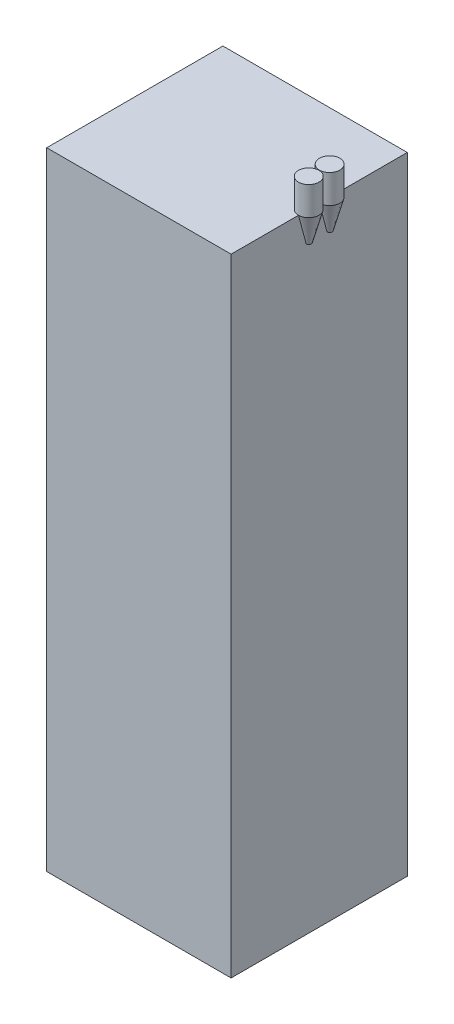
ISO-10303-21;
HEADER;
FILE_DESCRIPTION(('STEP AP214'),'2;1');
FILE_NAME('part.step','',(''),(''),'','','');
FILE_SCHEMA(('AUTOMOTIVE_DESIGN { 1 0 10303 214 1 1 1 1 }'));
ENDSEC;
DATA;
#1=APPLICATION_CONTEXT('core data for automotive mechanical design processes');
#2=APPLICATION_PROTOCOL_DEFINITION('international standard','automotive_design',2000,#1);
#3=PRODUCT_CONTEXT('',#1,'mechanical');
#4=PRODUCT('Part','Part','',(#3));
#5=PRODUCT_RELATED_PRODUCT_CATEGORY('part','',(#4));
#6=PRODUCT_DEFINITION_FORMATION('','',#4);
#7=PRODUCT_DEFINITION_CONTEXT('part definition',#1,'design');
#8=PRODUCT_DEFINITION('design','',#6,#7);
#9=PRODUCT_DEFINITION_SHAPE('','',#8);
#10=(LENGTH_UNIT() NAMED_UNIT(*) SI_UNIT(.MILLI.,.METRE.));
#11=(NAMED_UNIT(*) PLANE_ANGLE_UNIT() SI_UNIT($,.RADIAN.));
#12=(NAMED_UNIT(*) SI_UNIT($,.STERADIAN.) SOLID_ANGLE_UNIT());
#13=UNCERTAINTY_MEASURE_WITH_UNIT(LENGTH_MEASURE(1.E-05),#10,'distance_accuracy_value','');
#14=(GEOMETRIC_REPRESENTATION_CONTEXT(3) GLOBAL_UNCERTAINTY_ASSIGNED_CONTEXT((#13)) GLOBAL_UNIT_ASSIGNED_CONTEXT((#10,
#11,#12)) REPRESENTATION_CONTEXT('',''));
#15=CARTESIAN_POINT('',(0.,0.,0.));
#16=DIRECTION('',(0.,0.,1.));
#17=DIRECTION('',(1.,0.,0.));
#18=AXIS2_PLACEMENT_3D('',#15,#16,#17);
#19=CARTESIAN_POINT('',(22.5,153.,21.5));
#20=DIRECTION('',(-1.,0.,0.));
#21=DIRECTION('',(0.,0.,1.));
#22=AXIS2_PLACEMENT_3D('',#19,#20,#21);
#23=PLANE('',#22);
#24=DIRECTION('',(0.,0.965925826289068,0.258819045102521));
#25=VECTOR('',#24,1.);
#26=CARTESIAN_POINT('',(22.5,143.669872981078,-2.55));
#27=LINE('',#26,#25);
#28=CARTESIAN_POINT('',(22.5,153.,-0.050000000000001));
#29=VERTEX_POINT('',#28);
#30=CARTESIAN_POINT('',(22.5,146.,-1.92564434701787));
#31=VERTEX_POINT('',#30);
#32=EDGE_CURVE('E108',#29,#31,#27,.F.);
#33=ORIENTED_EDGE('',*,*,#32,.F.);
#34=DIRECTION('',(0.,0.,-1.));
#35=VECTOR('',#34,1.);
#36=CARTESIAN_POINT('',(22.5,153.,21.5));
#37=LINE('',#36,#35);
#38=CARTESIAN_POINT('',(22.5,153.,0.050000000000001));
#39=VERTEX_POINT('',#38);
#40=EDGE_CURVE('E118',#39,#29,#37,.T.);
#41=ORIENTED_EDGE('',*,*,#40,.F.);
#42=DIRECTION('',(0.,-0.965925826289068,0.258819045102521));
#43=VECTOR('',#42,1.);
#44=CARTESIAN_POINT('',(22.5,143.669872981078,2.55));
#45=LINE('',#44,#43);
#46=CARTESIAN_POINT('',(22.5,146.,1.92564434701787));
#47=VERTEX_POINT('',#46);
#48=EDGE_CURVE('E63',#47,#39,#45,.F.);
#49=ORIENTED_EDGE('',*,*,#48,.F.);
#50=DIRECTION('',(0.,0.,1.));
#51=VECTOR('',#50,1.);
#52=CARTESIAN_POINT('',(22.5,146.,21.5));
#53=LINE('',#52,#51);
#54=CARTESIAN_POINT('',(22.5,146.,3.17435565298213));
#55=VERTEX_POINT('',#54);
#56=EDGE_CURVE('E48',#47,#55,#53,.T.);
#57=ORIENTED_EDGE('',*,*,#56,.T.);
#58=DIRECTION('',(0.,0.965925826289068,0.258819045102521));
#59=VECTOR('',#58,1.);
#60=CARTESIAN_POINT('',(22.5,143.669872981078,2.55));
#61=LINE('',#60,#59);
#62=CARTESIAN_POINT('',(22.5,153.,5.05));
#63=VERTEX_POINT('',#62);
#64=EDGE_CURVE('E168',#63,#55,#61,.F.);
#65=ORIENTED_EDGE('',*,*,#64,.F.);
#66=CARTESIAN_POINT('',(22.5,153.,21.5));
#67=VERTEX_POINT('',#66);
#68=EDGE_CURVE('E129',#67,#63,#37,.T.);
#69=ORIENTED_EDGE('',*,*,#68,.F.);
#70=DIRECTION('',(0.,-1.,0.));
#71=VECTOR('',#70,1.);
#72=CARTESIAN_POINT('',(22.5,153.,21.5));
#73=LINE('',#72,#71);
#74=CARTESIAN_POINT('',(22.5,0.,21.5));
#75=VERTEX_POINT('',#74);
#76=EDGE_CURVE('E146',#67,#75,#73,.T.);
#77=ORIENTED_EDGE('',*,*,#76,.T.);
#78=DIRECTION('',(0.,0.,-1.));
#79=VECTOR('',#78,1.);
#80=CARTESIAN_POINT('',(22.5,0.,21.5));
#81=LINE('',#80,#79);
#82=CARTESIAN_POINT('',(22.5,0.,-21.5));
#83=VERTEX_POINT('',#82);
#84=EDGE_CURVE('E156',#75,#83,#81,.T.);
#85=ORIENTED_EDGE('',*,*,#84,.T.);
#86=DIRECTION('',(0.,-1.,0.));
#87=VECTOR('',#86,1.);
#88=CARTESIAN_POINT('',(22.5,153.,-21.5));
#89=LINE('',#88,#87);
#90=CARTESIAN_POINT('',(22.5,153.,-21.5));
#91=VERTEX_POINT('',#90);
#92=EDGE_CURVE('E135',#91,#83,#89,.T.);
#93=ORIENTED_EDGE('',*,*,#92,.F.);
#94=CARTESIAN_POINT('',(22.5,153.,-5.05));
#95=VERTEX_POINT('',#94);
#96=EDGE_CURVE('E130',#95,#91,#37,.T.);
#97=ORIENTED_EDGE('',*,*,#96,.F.);
#98=DIRECTION('',(0.,-0.965925826289068,0.258819045102521));
#99=VECTOR('',#98,1.);
#100=CARTESIAN_POINT('',(22.5,143.669872981078,-2.55));
#101=LINE('',#100,#99);
#102=CARTESIAN_POINT('',(22.5,146.,-3.17435565298213));
#103=VERTEX_POINT('',#102);
#104=EDGE_CURVE('E55',#103,#95,#101,.F.);
#105=ORIENTED_EDGE('',*,*,#104,.F.);
#106=DIRECTION('',(0.,0.,1.));
#107=VECTOR('',#106,1.);
#108=CARTESIAN_POINT('',(22.5,146.,21.5));
#109=LINE('',#108,#107);
#110=EDGE_CURVE('E11',#103,#31,#109,.T.);
#111=ORIENTED_EDGE('',*,*,#110,.T.);
#112=EDGE_LOOP('',(#33,#41,#49,#57,#65,#69,#77,#85,#93,#97,#105,#111));
#113=FACE_BOUND('',#112,.T.);
#114=ADVANCED_FACE('F41',(#113),#23,.F.);
#115=CARTESIAN_POINT('',(-22.5,153.,-21.5));
#116=DIRECTION('',(0.,0.,1.));
#117=DIRECTION('',(1.,0.,0.));
#118=AXIS2_PLACEMENT_3D('',#115,#116,#117);
#119=PLANE('',#118);
#120=DIRECTION('',(-1.,0.,0.));
#121=VECTOR('',#120,1.);
#122=CARTESIAN_POINT('',(-22.5,0.,-21.5));
#123=LINE('',#122,#121);
#124=CARTESIAN_POINT('',(-22.5,0.,-21.5));
#125=VERTEX_POINT('',#124);
#126=EDGE_CURVE('E154',#83,#125,#123,.T.);
#127=ORIENTED_EDGE('',*,*,#126,.T.);
#128=DIRECTION('',(0.,-1.,0.));
#129=VECTOR('',#128,1.);
#130=CARTESIAN_POINT('',(-22.5,153.,-21.5));
#131=LINE('',#130,#129);
#132=CARTESIAN_POINT('',(-22.5,153.,-21.5));
#133=VERTEX_POINT('',#132);
#134=EDGE_CURVE('E140',#133,#125,#131,.T.);
#135=ORIENTED_EDGE('',*,*,#134,.F.);
#136=DIRECTION('',(-1.,0.,0.));
#137=VECTOR('',#136,1.);
#138=CARTESIAN_POINT('',(-22.5,153.,-21.5));
#139=LINE('',#138,#137);
#140=EDGE_CURVE('E163',#91,#133,#139,.T.);
#141=ORIENTED_EDGE('',*,*,#140,.F.);
#142=ORIENTED_EDGE('',*,*,#92,.T.);
#143=EDGE_LOOP('',(#127,#135,#141,#142));
#144=FACE_BOUND('',#143,.T.);
#145=ADVANCED_FACE('F182',(#144),#119,.F.);
#146=CARTESIAN_POINT('',(-22.5,153.,21.5));
#147=DIRECTION('',(1.,0.,0.));
#148=DIRECTION('',(0.,0.,-1.));
#149=AXIS2_PLACEMENT_3D('',#146,#147,#148);
#150=PLANE('',#149);
#151=DIRECTION('',(0.,0.,1.));
#152=VECTOR('',#151,1.);
#153=CARTESIAN_POINT('',(-22.5,0.,21.5));
#154=LINE('',#153,#152);
#155=CARTESIAN_POINT('',(-22.5,0.,21.5));
#156=VERTEX_POINT('',#155);
#157=EDGE_CURVE('E152',#125,#156,#154,.T.);
#158=ORIENTED_EDGE('',*,*,#157,.T.);
#159=DIRECTION('',(0.,-1.,0.));
#160=VECTOR('',#159,1.);
#161=CARTESIAN_POINT('',(-22.5,153.,21.5));
#162=LINE('',#161,#160);
#163=CARTESIAN_POINT('',(-22.5,153.,21.5));
#164=VERTEX_POINT('',#163);
#165=EDGE_CURVE('E143',#164,#156,#162,.T.);
#166=ORIENTED_EDGE('',*,*,#165,.F.);
#167=DIRECTION('',(0.,0.,1.));
#168=VECTOR('',#167,1.);
#169=CARTESIAN_POINT('',(-22.5,153.,21.5));
#170=LINE('',#169,#168);
#171=EDGE_CURVE('E161',#133,#164,#170,.T.);
#172=ORIENTED_EDGE('',*,*,#171,.F.);
#173=ORIENTED_EDGE('',*,*,#134,.T.);
#174=EDGE_LOOP('',(#158,#166,#172,#173));
#175=FACE_BOUND('',#174,.T.);
#176=ADVANCED_FACE('F187',(#175),#150,.F.);
#177=CARTESIAN_POINT('',(-22.5,153.,21.5));
#178=DIRECTION('',(0.,0.,-1.));
#179=DIRECTION('',(-1.,0.,0.));
#180=AXIS2_PLACEMENT_3D('',#177,#178,#179);
#181=PLANE('',#180);
#182=DIRECTION('',(1.,0.,0.));
#183=VECTOR('',#182,1.);
#184=CARTESIAN_POINT('',(-22.5,0.,21.5));
#185=LINE('',#184,#183);
#186=EDGE_CURVE('E150',#156,#75,#185,.T.);
#187=ORIENTED_EDGE('',*,*,#186,.T.);
#188=ORIENTED_EDGE('',*,*,#76,.F.);
#189=DIRECTION('',(1.,0.,0.));
#190=VECTOR('',#189,1.);
#191=CARTESIAN_POINT('',(-22.5,153.,21.5));
#192=LINE('',#191,#190);
#193=EDGE_CURVE('E149',#164,#67,#192,.T.);
#194=ORIENTED_EDGE('',*,*,#193,.F.);
#195=ORIENTED_EDGE('',*,*,#165,.T.);
#196=EDGE_LOOP('',(#187,#188,#194,#195));
#197=FACE_BOUND('',#196,.T.);
#198=ADVANCED_FACE('F192',(#197),#181,.F.);
#199=CARTESIAN_POINT('',(0.,153.,0.));
#200=DIRECTION('',(0.,-1.,0.));
#201=DIRECTION('',(0.,0.,-1.));
#202=AXIS2_PLACEMENT_3D('',#199,#200,#201);
#203=PLANE('',#202);
#204=CARTESIAN_POINT('',(22.5,153.,-2.55));
#205=DIRECTION('',(0.,-1.,0.));
#206=DIRECTION('',(0.,0.,-1.));
#207=AXIS2_PLACEMENT_3D('',#204,#205,#206);
#208=CIRCLE('',#207,2.5);
#209=EDGE_CURVE('E124',#95,#29,#208,.F.);
#210=ORIENTED_EDGE('',*,*,#209,.F.);
#211=ORIENTED_EDGE('',*,*,#96,.T.);
#212=ORIENTED_EDGE('',*,*,#140,.T.);
#213=ORIENTED_EDGE('',*,*,#171,.T.);
#214=ORIENTED_EDGE('',*,*,#193,.T.);
#215=ORIENTED_EDGE('',*,*,#68,.T.);
#216=CARTESIAN_POINT('',(22.5,153.,2.55));
#217=DIRECTION('',(0.,1.,0.));
#218=DIRECTION('',(0.,0.,1.));
#219=AXIS2_PLACEMENT_3D('',#216,#217,#218);
#220=CIRCLE('',#219,2.5);
#221=EDGE_CURVE('E128',#39,#63,#220,.T.);
#222=ORIENTED_EDGE('',*,*,#221,.F.);
#223=ORIENTED_EDGE('',*,*,#40,.T.);
#224=EDGE_LOOP('',(#210,#211,#212,#213,#214,#215,#222,#223));
#225=FACE_BOUND('',#224,.T.);
#226=ADVANCED_FACE('F123',(#225),#203,.F.);
#227=CARTESIAN_POINT('',(0.,0.,0.));
#228=DIRECTION('',(0.,-1.,0.));
#229=DIRECTION('',(0.,0.,-1.));
#230=AXIS2_PLACEMENT_3D('',#227,#228,#229);
#231=PLANE('',#230);
#232=ORIENTED_EDGE('',*,*,#84,.F.);
#233=ORIENTED_EDGE('',*,*,#186,.F.);
#234=ORIENTED_EDGE('',*,*,#157,.F.);
#235=ORIENTED_EDGE('',*,*,#126,.F.);
#236=EDGE_LOOP('',(#232,#233,#234,#235));
#237=FACE_BOUND('',#236,.T.);
#238=ADVANCED_FACE('F223',(#237),#231,.T.);
#239=CARTESIAN_POINT('',(22.5,160.,2.55));
#240=DIRECTION('',(0.,-1.,0.));
#241=DIRECTION('',(0.,0.,-1.));
#242=AXIS2_PLACEMENT_3D('',#239,#240,#241);
#243=CYLINDRICAL_SURFACE('',#242,2.5);
#244=CARTESIAN_POINT('',(22.5,160.,2.55));
#245=DIRECTION('',(0.,1.,0.));
#246=DIRECTION('',(0.,0.,1.));
#247=AXIS2_PLACEMENT_3D('',#244,#245,#246);
#248=CIRCLE('',#247,2.5);
#249=CARTESIAN_POINT('',(22.5,160.,5.05));
#250=VERTEX_POINT('',#249);
#251=EDGE_CURVE('E159',#250,#250,#248,.T.);
#252=ORIENTED_EDGE('',*,*,#251,.F.);
#253=EDGE_LOOP('',(#252));
#254=FACE_BOUND('',#253,.T.);
#255=EDGE_CURVE('E112',#63,#39,#220,.T.);
#256=ORIENTED_EDGE('',*,*,#255,.T.);
#257=ORIENTED_EDGE('',*,*,#221,.T.);
#258=EDGE_LOOP('',(#256,#257));
#259=FACE_BOUND('',#258,.T.);
#260=ADVANCED_FACE('F226',(#254,#259),#243,.T.);
#261=CARTESIAN_POINT('',(22.5,160.,2.55));
#262=DIRECTION('',(0.,1.,0.));
#263=DIRECTION('',(0.,0.,1.));
#264=AXIS2_PLACEMENT_3D('',#261,#262,#263);
#265=PLANE('',#264);
#266=ORIENTED_EDGE('',*,*,#251,.T.);
#267=EDGE_LOOP('',(#266));
#268=FACE_BOUND('',#267,.T.);
#269=ADVANCED_FACE('F231',(#268),#265,.T.);
#270=CARTESIAN_POINT('',(22.5,160.,-2.55));
#271=DIRECTION('',(0.,-1.,0.));
#272=DIRECTION('',(0.,0.,-1.));
#273=AXIS2_PLACEMENT_3D('',#270,#271,#272);
#274=CYLINDRICAL_SURFACE('',#273,2.5);
#275=CARTESIAN_POINT('',(22.5,160.,-2.55));
#276=DIRECTION('',(0.,1.,0.));
#277=DIRECTION('',(0.,0.,1.));
#278=AXIS2_PLACEMENT_3D('',#275,#276,#277);
#279=CIRCLE('',#278,2.5);
#280=CARTESIAN_POINT('',(22.5,160.,-0.050000000000001));
#281=VERTEX_POINT('',#280);
#282=EDGE_CURVE('E113',#281,#281,#279,.T.);
#283=ORIENTED_EDGE('',*,*,#282,.F.);
#284=EDGE_LOOP('',(#283));
#285=FACE_BOUND('',#284,.T.);
#286=CARTESIAN_POINT('',(22.5,153.,-2.55));
#287=DIRECTION('',(0.,1.,0.));
#288=DIRECTION('',(0.,0.,1.));
#289=AXIS2_PLACEMENT_3D('',#286,#287,#288);
#290=CIRCLE('',#289,2.5);
#291=EDGE_CURVE('E105',#29,#95,#290,.T.);
#292=ORIENTED_EDGE('',*,*,#291,.T.);
#293=ORIENTED_EDGE('',*,*,#209,.T.);
#294=EDGE_LOOP('',(#292,#293));
#295=FACE_BOUND('',#294,.T.);
#296=ADVANCED_FACE('F132',(#285,#295),#274,.T.);
#297=CARTESIAN_POINT('',(22.5,160.,-2.55));
#298=DIRECTION('',(0.,1.,0.));
#299=DIRECTION('',(0.,0.,1.));
#300=AXIS2_PLACEMENT_3D('',#297,#298,#299);
#301=PLANE('',#300);
#302=ORIENTED_EDGE('',*,*,#282,.T.);
#303=EDGE_LOOP('',(#302));
#304=FACE_BOUND('',#303,.T.);
#305=ADVANCED_FACE('F200',(#304),#301,.T.);
#306=CARTESIAN_POINT('',(22.5,146.,2.55));
#307=DIRECTION('',(0.,-1.,0.));
#308=DIRECTION('',(0.,0.,-1.));
#309=AXIS2_PLACEMENT_3D('',#306,#307,#308);
#310=PLANE('',#309);
#311=ORIENTED_EDGE('',*,*,#56,.F.);
#312=CARTESIAN_POINT('',(22.5,146.,2.55));
#313=DIRECTION('',(0.,-1.,0.));
#314=DIRECTION('',(0.,0.,-1.));
#315=AXIS2_PLACEMENT_3D('',#312,#313,#314);
#316=CIRCLE('',#315,0.624355652982134);
#317=EDGE_CURVE('E120',#47,#55,#316,.T.);
#318=ORIENTED_EDGE('',*,*,#317,.T.);
#319=EDGE_LOOP('',(#311,#318));
#320=FACE_BOUND('',#319,.T.);
#321=ADVANCED_FACE('F198',(#320),#310,.T.);
#322=CARTESIAN_POINT('',(22.5,153.,2.55));
#323=DIRECTION('',(0.,1.,0.));
#324=DIRECTION('',(0.,0.,-1.));
#325=AXIS2_PLACEMENT_3D('',#322,#323,#324);
#326=CONICAL_SURFACE('',#325,2.5,0.26179938779915);
#327=ORIENTED_EDGE('',*,*,#255,.F.);
#328=ORIENTED_EDGE('',*,*,#64,.T.);
#329=ORIENTED_EDGE('',*,*,#317,.F.);
#330=ORIENTED_EDGE('',*,*,#48,.T.);
#331=EDGE_LOOP('',(#327,#328,#329,#330));
#332=FACE_BOUND('',#331,.T.);
#333=ADVANCED_FACE('F196',(#332),#326,.T.);
#334=CARTESIAN_POINT('',(22.5,146.,-2.55));
#335=DIRECTION('',(0.,-1.,0.));
#336=DIRECTION('',(0.,0.,-1.));
#337=AXIS2_PLACEMENT_3D('',#334,#335,#336);
#338=PLANE('',#337);
#339=ORIENTED_EDGE('',*,*,#110,.F.);
#340=CARTESIAN_POINT('',(22.5,146.,-2.55));
#341=DIRECTION('',(0.,-1.,0.));
#342=DIRECTION('',(0.,0.,-1.));
#343=AXIS2_PLACEMENT_3D('',#340,#341,#342);
#344=CIRCLE('',#343,0.624355652982134);
#345=EDGE_CURVE('E175',#103,#31,#344,.T.);
#346=ORIENTED_EDGE('',*,*,#345,.T.);
#347=EDGE_LOOP('',(#339,#346));
#348=FACE_BOUND('',#347,.T.);
#349=ADVANCED_FACE('F177',(#348),#338,.T.);
#350=CARTESIAN_POINT('',(22.5,153.,-2.55));
#351=DIRECTION('',(0.,1.,0.));
#352=DIRECTION('',(0.,0.,-1.));
#353=AXIS2_PLACEMENT_3D('',#350,#351,#352);
#354=CONICAL_SURFACE('',#353,2.5,0.26179938779915);
#355=ORIENTED_EDGE('',*,*,#291,.F.);
#356=ORIENTED_EDGE('',*,*,#32,.T.);
#357=ORIENTED_EDGE('',*,*,#345,.F.);
#358=ORIENTED_EDGE('',*,*,#104,.T.);
#359=EDGE_LOOP('',(#355,#356,#357,#358));
#360=FACE_BOUND('',#359,.T.);
#361=ADVANCED_FACE('F107',(#360),#354,.T.);
#362=CLOSED_SHELL('',(#114,#145,#176,#198,#226,#238,#260,#269,#296,#305,#321,#333,#349,#361));
#363=MANIFOLD_SOLID_BREP('B2',#362);
#364=ADVANCED_BREP_SHAPE_REPRESENTATION('',(#18,#363),#14);
#365=SHAPE_DEFINITION_REPRESENTATION(#9,#364);
ENDSEC;
END-ISO-10303-21;
